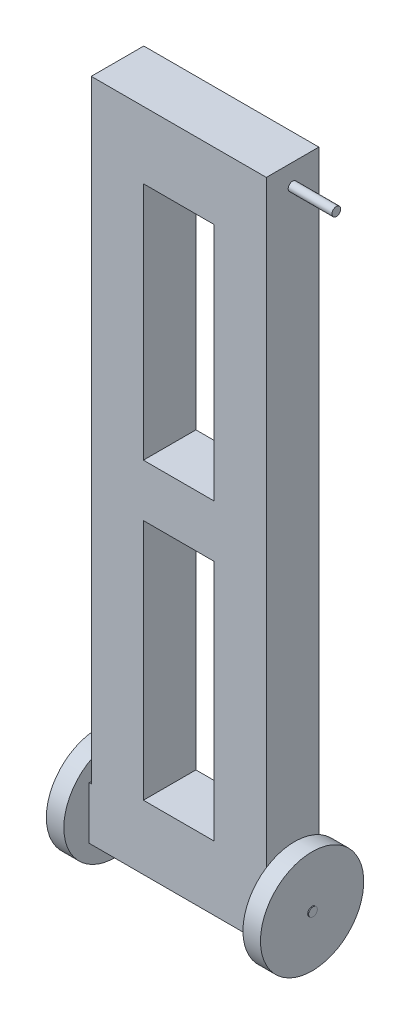
ISO-10303-21;
HEADER;
FILE_DESCRIPTION(('STEP AP214'),'2;1');
FILE_NAME('part.step','',(''),(''),'','','');
FILE_SCHEMA(('AUTOMOTIVE_DESIGN { 1 0 10303 214 1 1 1 1 }'));
ENDSEC;
DATA;
#1=APPLICATION_CONTEXT('core data for automotive mechanical design processes');
#2=APPLICATION_PROTOCOL_DEFINITION('international standard','automotive_design',2000,#1);
#3=PRODUCT_CONTEXT('',#1,'mechanical');
#4=PRODUCT('Part','Part','',(#3));
#5=PRODUCT_RELATED_PRODUCT_CATEGORY('part','',(#4));
#6=PRODUCT_DEFINITION_FORMATION('','',#4);
#7=PRODUCT_DEFINITION_CONTEXT('part definition',#1,'design');
#8=PRODUCT_DEFINITION('design','',#6,#7);
#9=PRODUCT_DEFINITION_SHAPE('','',#8);
#10=(LENGTH_UNIT() NAMED_UNIT(*) SI_UNIT(.MILLI.,.METRE.));
#11=(NAMED_UNIT(*) PLANE_ANGLE_UNIT() SI_UNIT($,.RADIAN.));
#12=(NAMED_UNIT(*) SI_UNIT($,.STERADIAN.) SOLID_ANGLE_UNIT());
#13=UNCERTAINTY_MEASURE_WITH_UNIT(LENGTH_MEASURE(1.E-05),#10,'distance_accuracy_value','');
#14=(GEOMETRIC_REPRESENTATION_CONTEXT(3) GLOBAL_UNCERTAINTY_ASSIGNED_CONTEXT((#13)) GLOBAL_UNIT_ASSIGNED_CONTEXT((#10,
#11,#12)) REPRESENTATION_CONTEXT('',''));
#15=CARTESIAN_POINT('',(0.,0.,0.));
#16=DIRECTION('',(0.,0.,1.));
#17=DIRECTION('',(1.,0.,0.));
#18=AXIS2_PLACEMENT_3D('',#15,#16,#17);
#19=CARTESIAN_POINT('',(61.15,0.,0.));
#20=DIRECTION('',(-1.,0.,0.));
#21=DIRECTION('',(0.,0.,1.));
#22=AXIS2_PLACEMENT_3D('',#19,#20,#21);
#23=CYLINDRICAL_SURFACE('',#22,29.5);
#24=CARTESIAN_POINT('',(-61.15,0.,0.));
#25=DIRECTION('',(1.,0.,0.));
#26=DIRECTION('',(0.,0.,-1.));
#27=AXIS2_PLACEMENT_3D('',#24,#25,#26);
#28=CIRCLE('',#27,29.5);
#29=CARTESIAN_POINT('',(-61.15,0.,29.5));
#30=VERTEX_POINT('',#29);
#31=EDGE_CURVE('E61',#30,#30,#28,.T.);
#32=CARTESIAN_POINT('',(-51.15,0.,0.));
#33=DIRECTION('',(1.,0.,0.));
#34=DIRECTION('',(0.,0.,-1.));
#35=AXIS2_PLACEMENT_3D('',#32,#33,#34);
#36=CIRCLE('',#35,29.5);
#37=CARTESIAN_POINT('',(-51.15,0.,29.5));
#38=VERTEX_POINT('',#37);
#39=EDGE_CURVE('E57',#38,#38,#36,.T.);
#40=CARTESIAN_POINT('',(-61.15,0.,29.5));
#41=CARTESIAN_POINT('',(-61.0458333333333,0.,29.5));
#42=CARTESIAN_POINT('',(-60.9416666666667,0.,29.5));
#43=CARTESIAN_POINT('',(-60.7333333333333,0.,29.5));
#44=CARTESIAN_POINT('',(-60.6291666666667,0.,29.5));
#45=CARTESIAN_POINT('',(-60.4208333333333,0.,29.5));
#46=CARTESIAN_POINT('',(-60.3166666666667,0.,29.5));
#47=CARTESIAN_POINT('',(-60.1083333333333,0.,29.5));
#48=CARTESIAN_POINT('',(-60.0041666666667,0.,29.5));
#49=CARTESIAN_POINT('',(-59.7958333333333,0.,29.5));
#50=CARTESIAN_POINT('',(-59.6916666666667,0.,29.5));
#51=CARTESIAN_POINT('',(-59.4833333333333,0.,29.5));
#52=CARTESIAN_POINT('',(-59.3791666666667,0.,29.5));
#53=CARTESIAN_POINT('',(-59.1708333333333,0.,29.5));
#54=CARTESIAN_POINT('',(-59.0666666666667,0.,29.5));
#55=CARTESIAN_POINT('',(-58.8583333333333,0.,29.5));
#56=CARTESIAN_POINT('',(-58.7541666666667,0.,29.5));
#57=CARTESIAN_POINT('',(-58.5458333333333,0.,29.5));
#58=CARTESIAN_POINT('',(-58.4416666666667,0.,29.5));
#59=CARTESIAN_POINT('',(-58.2333333333333,0.,29.5));
#60=CARTESIAN_POINT('',(-58.1291666666667,0.,29.5));
#61=CARTESIAN_POINT('',(-57.9208333333333,0.,29.5));
#62=CARTESIAN_POINT('',(-57.8166666666667,0.,29.5));
#63=CARTESIAN_POINT('',(-57.6083333333333,0.,29.5));
#64=CARTESIAN_POINT('',(-57.5041666666667,0.,29.5));
#65=CARTESIAN_POINT('',(-57.2958333333333,0.,29.5));
#66=CARTESIAN_POINT('',(-57.1916666666667,0.,29.5));
#67=CARTESIAN_POINT('',(-56.9833333333333,0.,29.5));
#68=CARTESIAN_POINT('',(-56.8791666666667,0.,29.5));
#69=CARTESIAN_POINT('',(-56.6708333333333,0.,29.5));
#70=CARTESIAN_POINT('',(-56.5666666666667,0.,29.5));
#71=CARTESIAN_POINT('',(-56.3583333333333,0.,29.5));
#72=CARTESIAN_POINT('',(-56.2541666666667,0.,29.5));
#73=CARTESIAN_POINT('',(-56.0458333333333,0.,29.5));
#74=CARTESIAN_POINT('',(-55.9416666666667,0.,29.5));
#75=CARTESIAN_POINT('',(-55.7333333333333,0.,29.5));
#76=CARTESIAN_POINT('',(-55.6291666666667,0.,29.5));
#77=CARTESIAN_POINT('',(-55.4208333333333,0.,29.5));
#78=CARTESIAN_POINT('',(-55.3166666666667,0.,29.5));
#79=CARTESIAN_POINT('',(-55.1083333333333,0.,29.5));
#80=CARTESIAN_POINT('',(-55.0041666666667,0.,29.5));
#81=CARTESIAN_POINT('',(-54.7958333333333,0.,29.5));
#82=CARTESIAN_POINT('',(-54.6916666666667,0.,29.5));
#83=CARTESIAN_POINT('',(-54.4833333333333,0.,29.5));
#84=CARTESIAN_POINT('',(-54.3791666666667,0.,29.5));
#85=CARTESIAN_POINT('',(-54.1708333333333,0.,29.5));
#86=CARTESIAN_POINT('',(-54.0666666666667,0.,29.5));
#87=CARTESIAN_POINT('',(-53.8583333333333,0.,29.5));
#88=CARTESIAN_POINT('',(-53.7541666666667,0.,29.5));
#89=CARTESIAN_POINT('',(-53.5458333333333,0.,29.5));
#90=CARTESIAN_POINT('',(-53.4416666666667,0.,29.5));
#91=CARTESIAN_POINT('',(-53.2333333333333,0.,29.5));
#92=CARTESIAN_POINT('',(-53.1291666666667,0.,29.5));
#93=CARTESIAN_POINT('',(-52.9208333333333,0.,29.5));
#94=CARTESIAN_POINT('',(-52.8166666666667,0.,29.5));
#95=CARTESIAN_POINT('',(-52.6083333333333,0.,29.5));
#96=CARTESIAN_POINT('',(-52.5041666666667,0.,29.5));
#97=CARTESIAN_POINT('',(-52.2958333333333,0.,29.5));
#98=CARTESIAN_POINT('',(-52.1916666666667,0.,29.5));
#99=CARTESIAN_POINT('',(-51.9833333333333,0.,29.5));
#100=CARTESIAN_POINT('',(-51.8791666666667,0.,29.5));
#101=CARTESIAN_POINT('',(-51.6708333333333,0.,29.5));
#102=CARTESIAN_POINT('',(-51.5666666666667,0.,29.5));
#103=CARTESIAN_POINT('',(-51.3583333333333,0.,29.5));
#104=CARTESIAN_POINT('',(-51.2541666666667,0.,29.5));
#105=CARTESIAN_POINT('',(-51.15,0.,29.5));
#106=B_SPLINE_CURVE_WITH_KNOTS('',3,(#40,#41,#42,#43,#44,#45,#46,#47,#48,#49,#50,#51,#52,#53,
#54,#55,#56,#57,#58,#59,#60,#61,#62,#63,#64,#65,#66,#67,#68,#69,#70,#71,#72,#73,#74,#75,#76,#77,
#78,#79,#80,#81,#82,#83,#84,#85,#86,#87,#88,#89,#90,#91,#92,#93,#94,#95,#96,#97,#98,#99,#100,
#101,#102,#103,#104,#105),.UNSPECIFIED.,.F.,.F.,(4,2,2,2,2,2,2,2,2,2,2,2,2,2,2,2,2,2,2,2,2,2,2,
2,2,2,2,2,2,2,2,2,4),(0.,0.312499999999993,0.625000000000001,0.937500000000008,1.25,
1.56249999999999,1.875,2.18750000000001,2.5,2.8125,3.125,3.43750000000001,3.75,4.0625,4.375,
4.68750000000001,5.,5.3125,5.62500000000001,5.93750000000001,6.25000000000001,6.5625,
6.87500000000001,7.18750000000001,7.50000000000001,7.8125,8.12500000000001,8.43750000000001,
8.75000000000001,9.0625,9.37500000000001,9.68750000000002,10.),.UNSPECIFIED.);
#107=EDGE_CURVE('BSEAM51',#30,#38,#106,.T.);
#108=ORIENTED_EDGE('',*,*,#31,.T.);
#109=ORIENTED_EDGE('',*,*,#39,.F.);
#110=ORIENTED_EDGE('',*,*,#107,.T.);
#111=ORIENTED_EDGE('',*,*,#107,.F.);
#112=EDGE_LOOP('',(#108,#110,#109,#111));
#113=FACE_BOUND('',#112,.T.);
#114=ADVANCED_FACE('F51',(#113),#23,.T.);
#115=CARTESIAN_POINT('',(-61.15,0.,0.));
#116=DIRECTION('',(1.,0.,0.));
#117=DIRECTION('',(0.,0.,-1.));
#118=AXIS2_PLACEMENT_3D('',#115,#116,#117);
#119=PLANE('',#118);
#120=CARTESIAN_POINT('',(-61.15,0.,0.));
#121=DIRECTION('',(1.,0.,0.));
#122=DIRECTION('',(0.,0.,-1.));
#123=AXIS2_PLACEMENT_3D('',#120,#121,#122);
#124=CIRCLE('',#123,2.5);
#125=CARTESIAN_POINT('',(-61.15,0.,-2.5));
#126=VERTEX_POINT('',#125);
#127=EDGE_CURVE('E11',#126,#126,#124,.F.);
#128=ORIENTED_EDGE('',*,*,#127,.F.);
#129=EDGE_LOOP('',(#128));
#130=FACE_BOUND('',#129,.T.);
#131=ORIENTED_EDGE('',*,*,#31,.F.);
#132=EDGE_LOOP('',(#131));
#133=FACE_BOUND('',#132,.T.);
#134=ADVANCED_FACE('F83',(#130,#133),#119,.F.);
#135=CARTESIAN_POINT('',(-51.15,0.,0.));
#136=DIRECTION('',(1.,0.,0.));
#137=DIRECTION('',(0.,0.,-1.));
#138=AXIS2_PLACEMENT_3D('',#135,#136,#137);
#139=PLANE('',#138);
#140=ORIENTED_EDGE('',*,*,#39,.T.);
#141=EDGE_LOOP('',(#140));
#142=FACE_BOUND('',#141,.T.);
#143=ADVANCED_FACE('F75',(#142),#139,.T.);
#144=CARTESIAN_POINT('',(-61.65,0.,0.));
#145=DIRECTION('',(1.,0.,0.));
#146=DIRECTION('',(0.,0.,-1.));
#147=AXIS2_PLACEMENT_3D('',#144,#145,#146);
#148=CYLINDRICAL_SURFACE('',#147,2.5);
#149=CARTESIAN_POINT('',(-61.65,0.,0.));
#150=DIRECTION('',(-1.,0.,0.));
#151=DIRECTION('',(0.,0.,1.));
#152=AXIS2_PLACEMENT_3D('',#149,#150,#151);
#153=CIRCLE('',#152,2.5);
#154=CARTESIAN_POINT('',(-61.65,0.,2.5));
#155=VERTEX_POINT('',#154);
#156=EDGE_CURVE('E65',#155,#155,#153,.T.);
#157=ORIENTED_EDGE('',*,*,#156,.F.);
#158=EDGE_LOOP('',(#157));
#159=FACE_BOUND('',#158,.T.);
#160=ORIENTED_EDGE('',*,*,#127,.T.);
#161=EDGE_LOOP('',(#160));
#162=FACE_BOUND('',#161,.T.);
#163=ADVANCED_FACE('F73',(#159,#162),#148,.T.);
#164=CARTESIAN_POINT('',(-61.65,0.,0.));
#165=DIRECTION('',(-1.,0.,0.));
#166=DIRECTION('',(0.,0.,1.));
#167=AXIS2_PLACEMENT_3D('',#164,#165,#166);
#168=PLANE('',#167);
#169=ORIENTED_EDGE('',*,*,#156,.T.);
#170=EDGE_LOOP('',(#169));
#171=FACE_BOUND('',#170,.T.);
#172=ADVANCED_FACE('F71',(#171),#168,.T.);
#173=CLOSED_SHELL('',(#114,#134,#143,#163,#172));
#174=MANIFOLD_SOLID_BREP('B2',#173);
#175=CARTESIAN_POINT('',(-20.2139710277099,326.774191842446,-29.501));
#176=DIRECTION('',(-1.,0.,0.));
#177=DIRECTION('',(0.,-1.,0.));
#178=AXIS2_PLACEMENT_3D('',#175,#176,#177);
#179=PLANE('',#178);
#180=DIRECTION('',(0.,1.,0.));
#181=VECTOR('',#180,1.);
#182=CARTESIAN_POINT('',(-20.2139710277099,326.774191842446,-15.));
#183=LINE('',#182,#181);
#184=CARTESIAN_POINT('',(-20.2139710277099,21.7741918424582,-15.));
#185=VERTEX_POINT('',#184);
#186=CARTESIAN_POINT('',(-20.2139710277099,160.136194561291,-15.));
#187=VERTEX_POINT('',#186);
#188=EDGE_CURVE('E283',#185,#187,#183,.T.);
#189=ORIENTED_EDGE('',*,*,#188,.T.);
#190=DIRECTION('',(0.,0.,1.));
#191=VECTOR('',#190,1.);
#192=CARTESIAN_POINT('',(-20.2139710277099,160.136194561291,-29.501));
#193=LINE('',#192,#191);
#194=CARTESIAN_POINT('',(-20.2139710277099,160.136194561291,15.));
#195=VERTEX_POINT('',#194);
#196=EDGE_CURVE('E248',#187,#195,#193,.T.);
#197=ORIENTED_EDGE('',*,*,#196,.T.);
#198=DIRECTION('',(0.,-1.,0.));
#199=VECTOR('',#198,1.);
#200=CARTESIAN_POINT('',(-20.2139710277099,326.774191842446,15.));
#201=LINE('',#200,#199);
#202=CARTESIAN_POINT('',(-20.2139710277099,21.7741918424582,15.));
#203=VERTEX_POINT('',#202);
#204=EDGE_CURVE('E292',#195,#203,#201,.T.);
#205=ORIENTED_EDGE('',*,*,#204,.T.);
#206=DIRECTION('',(0.,0.,1.));
#207=VECTOR('',#206,1.);
#208=CARTESIAN_POINT('',(-20.2139710277099,21.7741918424582,-29.501));
#209=LINE('',#208,#207);
#210=EDGE_CURVE('E300',#185,#203,#209,.T.);
#211=ORIENTED_EDGE('',*,*,#210,.F.);
#212=EDGE_LOOP('',(#189,#197,#205,#211));
#213=FACE_BOUND('',#212,.T.);
#214=ADVANCED_FACE('F122',(#213),#179,.F.);
#215=CARTESIAN_POINT('',(20.2139710277099,326.774191842446,-29.501));
#216=DIRECTION('',(-1.,0.,0.));
#217=DIRECTION('',(0.,-1.,0.));
#218=AXIS2_PLACEMENT_3D('',#215,#216,#217);
#219=PLANE('',#218);
#220=DIRECTION('',(0.,0.,1.));
#221=VECTOR('',#220,1.);
#222=CARTESIAN_POINT('',(20.2139710277099,160.136194561291,-15.));
#223=LINE('',#222,#221);
#224=CARTESIAN_POINT('',(20.2139710277099,160.136194561291,-15.));
#225=VERTEX_POINT('',#224);
#226=CARTESIAN_POINT('',(20.2139710277099,160.136194561291,15.));
#227=VERTEX_POINT('',#226);
#228=EDGE_CURVE('E146',#225,#227,#223,.T.);
#229=ORIENTED_EDGE('',*,*,#228,.F.);
#230=DIRECTION('',(0.,1.,0.));
#231=VECTOR('',#230,1.);
#232=CARTESIAN_POINT('',(20.2139710277099,326.774191842446,-15.));
#233=LINE('',#232,#231);
#234=CARTESIAN_POINT('',(20.2139710277099,21.7741918424582,-15.));
#235=VERTEX_POINT('',#234);
#236=EDGE_CURVE('E247',#235,#225,#233,.T.);
#237=ORIENTED_EDGE('',*,*,#236,.F.);
#238=DIRECTION('',(0.,0.,1.));
#239=VECTOR('',#238,1.);
#240=CARTESIAN_POINT('',(20.2139710277099,21.7741918424582,-29.501));
#241=LINE('',#240,#239);
#242=CARTESIAN_POINT('',(20.2139710277099,21.7741918424582,15.));
#243=VERTEX_POINT('',#242);
#244=EDGE_CURVE('E279',#235,#243,#241,.T.);
#245=ORIENTED_EDGE('',*,*,#244,.T.);
#246=DIRECTION('',(0.,-1.,0.));
#247=VECTOR('',#246,1.);
#248=CARTESIAN_POINT('',(20.2139710277099,326.774191842446,15.));
#249=LINE('',#248,#247);
#250=EDGE_CURVE('E276',#227,#243,#249,.T.);
#251=ORIENTED_EDGE('',*,*,#250,.F.);
#252=EDGE_LOOP('',(#229,#237,#245,#251));
#253=FACE_BOUND('',#252,.T.);
#254=ADVANCED_FACE('F395',(#253),#219,.T.);
#255=CARTESIAN_POINT('',(-61.652,15.,-15.));
#256=DIRECTION('',(0.,0.,1.));
#257=DIRECTION('',(1.,0.,0.));
#258=AXIS2_PLACEMENT_3D('',#255,#256,#257);
#259=PLANE('',#258);
#260=DIRECTION('',(-1.,0.,0.));
#261=VECTOR('',#260,1.);
#262=CARTESIAN_POINT('',(20.2139710277099,160.136194561291,-15.));
#263=LINE('',#262,#261);
#264=EDGE_CURVE('E253',#225,#187,#263,.T.);
#265=ORIENTED_EDGE('',*,*,#264,.T.);
#266=ORIENTED_EDGE('',*,*,#188,.F.);
#267=DIRECTION('',(-1.,0.,0.));
#268=VECTOR('',#267,1.);
#269=CARTESIAN_POINT('',(0.,21.7741918424582,-15.));
#270=LINE('',#269,#268);
#271=EDGE_CURVE('E286',#235,#185,#270,.T.);
#272=ORIENTED_EDGE('',*,*,#271,.F.);
#273=ORIENTED_EDGE('',*,*,#236,.T.);
#274=EDGE_LOOP('',(#265,#266,#272,#273));
#275=FACE_BOUND('',#274,.T.);
#276=DIRECTION('',(1.,0.,0.));
#277=VECTOR('',#276,1.);
#278=CARTESIAN_POINT('',(-61.652,15.,-15.));
#279=LINE('',#278,#277);
#280=CARTESIAN_POINT('',(-51.15,15.,-15.));
#281=VERTEX_POINT('',#280);
#282=CARTESIAN_POINT('',(-50.,15.,-15.));
#283=VERTEX_POINT('',#282);
#284=EDGE_CURVE('E348',#281,#283,#279,.T.);
#285=ORIENTED_EDGE('',*,*,#284,.T.);
#286=DIRECTION('',(0.,-1.,0.));
#287=VECTOR('',#286,1.);
#288=CARTESIAN_POINT('',(-50.,365.,-15.));
#289=LINE('',#288,#287);
#290=CARTESIAN_POINT('',(-50.,365.,-15.));
#291=VERTEX_POINT('',#290);
#292=EDGE_CURVE('E324',#291,#283,#289,.T.);
#293=ORIENTED_EDGE('',*,*,#292,.F.);
#294=DIRECTION('',(-1.,0.,0.));
#295=VECTOR('',#294,1.);
#296=CARTESIAN_POINT('',(-50.,365.,-15.));
#297=LINE('',#296,#295);
#298=CARTESIAN_POINT('',(50.,365.,-15.));
#299=VERTEX_POINT('',#298);
#300=EDGE_CURVE('E322',#299,#291,#297,.T.);
#301=ORIENTED_EDGE('',*,*,#300,.F.);
#302=DIRECTION('',(0.,-1.,0.));
#303=VECTOR('',#302,1.);
#304=CARTESIAN_POINT('',(50.,365.,-15.));
#305=LINE('',#304,#303);
#306=CARTESIAN_POINT('',(50.,15.,-15.));
#307=VERTEX_POINT('',#306);
#308=EDGE_CURVE('E314',#299,#307,#305,.T.);
#309=ORIENTED_EDGE('',*,*,#308,.T.);
#310=CARTESIAN_POINT('',(51.15,15.,-15.));
#311=VERTEX_POINT('',#310);
#312=EDGE_CURVE('E351',#307,#311,#279,.T.);
#313=ORIENTED_EDGE('',*,*,#312,.T.);
#314=DIRECTION('',(0.,-1.,0.));
#315=VECTOR('',#314,1.);
#316=CARTESIAN_POINT('',(51.15,15.,-15.));
#317=LINE('',#316,#315);
#318=CARTESIAN_POINT('',(51.15,-15.,-15.));
#319=VERTEX_POINT('',#318);
#320=EDGE_CURVE('E334',#311,#319,#317,.T.);
#321=ORIENTED_EDGE('',*,*,#320,.T.);
#322=DIRECTION('',(1.,0.,0.));
#323=VECTOR('',#322,1.);
#324=CARTESIAN_POINT('',(-61.652,-15.,-15.));
#325=LINE('',#324,#323);
#326=CARTESIAN_POINT('',(-51.15,-15.,-15.));
#327=VERTEX_POINT('',#326);
#328=EDGE_CURVE('E354',#327,#319,#325,.T.);
#329=ORIENTED_EDGE('',*,*,#328,.F.);
#330=DIRECTION('',(0.,1.,0.));
#331=VECTOR('',#330,1.);
#332=CARTESIAN_POINT('',(-51.15,15.,-15.));
#333=LINE('',#332,#331);
#334=EDGE_CURVE('E358',#327,#281,#333,.T.);
#335=ORIENTED_EDGE('',*,*,#334,.T.);
#336=EDGE_LOOP('',(#285,#293,#301,#309,#313,#321,#329,#335));
#337=FACE_BOUND('',#336,.T.);
#338=CARTESIAN_POINT('',(-20.2139710277099,190.,-15.));
#339=VERTEX_POINT('',#338);
#340=CARTESIAN_POINT('',(-20.2139710277099,326.774191842446,-15.));
#341=VERTEX_POINT('',#340);
#342=EDGE_CURVE('E252',#339,#341,#183,.T.);
#343=ORIENTED_EDGE('',*,*,#342,.F.);
#344=DIRECTION('',(-1.,0.,0.));
#345=VECTOR('',#344,1.);
#346=CARTESIAN_POINT('',(20.2139710277099,190.,-15.));
#347=LINE('',#346,#345);
#348=CARTESIAN_POINT('',(20.2139710277099,190.,-15.));
#349=VERTEX_POINT('',#348);
#350=EDGE_CURVE('E138',#349,#339,#347,.T.);
#351=ORIENTED_EDGE('',*,*,#350,.F.);
#352=CARTESIAN_POINT('',(20.2139710277099,326.774191842446,-15.));
#353=VERTEX_POINT('',#352);
#354=EDGE_CURVE('E237',#349,#353,#233,.T.);
#355=ORIENTED_EDGE('',*,*,#354,.T.);
#356=DIRECTION('',(1.,0.,0.));
#357=VECTOR('',#356,1.);
#358=CARTESIAN_POINT('',(0.,326.774191842446,-15.));
#359=LINE('',#358,#357);
#360=EDGE_CURVE('E303',#341,#353,#359,.T.);
#361=ORIENTED_EDGE('',*,*,#360,.F.);
#362=EDGE_LOOP('',(#343,#351,#355,#361));
#363=FACE_BOUND('',#362,.T.);
#364=ADVANCED_FACE('F251',(#275,#337,#363),#259,.F.);
#365=CARTESIAN_POINT('',(-61.652,15.,15.));
#366=DIRECTION('',(0.,0.,-1.));
#367=DIRECTION('',(-1.,0.,0.));
#368=AXIS2_PLACEMENT_3D('',#365,#366,#367);
#369=PLANE('',#368);
#370=DIRECTION('',(0.,-1.,0.));
#371=VECTOR('',#370,1.);
#372=CARTESIAN_POINT('',(-50.,365.,15.));
#373=LINE('',#372,#371);
#374=CARTESIAN_POINT('',(-50.,365.,15.));
#375=VERTEX_POINT('',#374);
#376=CARTESIAN_POINT('',(-50.,15.,15.));
#377=VERTEX_POINT('',#376);
#378=EDGE_CURVE('E328',#375,#377,#373,.T.);
#379=ORIENTED_EDGE('',*,*,#378,.T.);
#380=DIRECTION('',(1.,0.,0.));
#381=VECTOR('',#380,1.);
#382=CARTESIAN_POINT('',(-61.652,15.,15.));
#383=LINE('',#382,#381);
#384=CARTESIAN_POINT('',(-51.15,15.,15.));
#385=VERTEX_POINT('',#384);
#386=EDGE_CURVE('E343',#385,#377,#383,.T.);
#387=ORIENTED_EDGE('',*,*,#386,.F.);
#388=DIRECTION('',(0.,-1.,0.));
#389=VECTOR('',#388,1.);
#390=CARTESIAN_POINT('',(-51.15,15.,15.));
#391=LINE('',#390,#389);
#392=CARTESIAN_POINT('',(-51.15,-15.,15.));
#393=VERTEX_POINT('',#392);
#394=EDGE_CURVE('E363',#385,#393,#391,.T.);
#395=ORIENTED_EDGE('',*,*,#394,.T.);
#396=DIRECTION('',(1.,0.,0.));
#397=VECTOR('',#396,1.);
#398=CARTESIAN_POINT('',(-61.652,-15.,15.));
#399=LINE('',#398,#397);
#400=CARTESIAN_POINT('',(51.15,-15.,15.));
#401=VERTEX_POINT('',#400);
#402=EDGE_CURVE('E340',#393,#401,#399,.T.);
#403=ORIENTED_EDGE('',*,*,#402,.T.);
#404=DIRECTION('',(0.,1.,0.));
#405=VECTOR('',#404,1.);
#406=CARTESIAN_POINT('',(51.15,15.,15.));
#407=LINE('',#406,#405);
#408=CARTESIAN_POINT('',(51.15,15.,15.));
#409=VERTEX_POINT('',#408);
#410=EDGE_CURVE('E330',#401,#409,#407,.T.);
#411=ORIENTED_EDGE('',*,*,#410,.T.);
#412=CARTESIAN_POINT('',(50.,15.,15.));
#413=VERTEX_POINT('',#412);
#414=EDGE_CURVE('E347',#413,#409,#383,.T.);
#415=ORIENTED_EDGE('',*,*,#414,.F.);
#416=DIRECTION('',(0.,-1.,0.));
#417=VECTOR('',#416,1.);
#418=CARTESIAN_POINT('',(50.,365.,15.));
#419=LINE('',#418,#417);
#420=CARTESIAN_POINT('',(50.,365.,15.));
#421=VERTEX_POINT('',#420);
#422=EDGE_CURVE('E310',#421,#413,#419,.T.);
#423=ORIENTED_EDGE('',*,*,#422,.F.);
#424=DIRECTION('',(1.,0.,0.));
#425=VECTOR('',#424,1.);
#426=CARTESIAN_POINT('',(-50.,365.,15.));
#427=LINE('',#426,#425);
#428=EDGE_CURVE('E320',#375,#421,#427,.T.);
#429=ORIENTED_EDGE('',*,*,#428,.F.);
#430=EDGE_LOOP('',(#379,#387,#395,#403,#411,#415,#423,#429));
#431=FACE_BOUND('',#430,.T.);
#432=DIRECTION('',(-1.,0.,0.));
#433=VECTOR('',#432,1.);
#434=CARTESIAN_POINT('',(20.2139710277099,190.,15.));
#435=LINE('',#434,#433);
#436=CARTESIAN_POINT('',(20.2139710277099,190.,15.));
#437=VERTEX_POINT('',#436);
#438=CARTESIAN_POINT('',(-20.2139710277099,190.,15.));
#439=VERTEX_POINT('',#438);
#440=EDGE_CURVE('E254',#437,#439,#435,.T.);
#441=ORIENTED_EDGE('',*,*,#440,.T.);
#442=CARTESIAN_POINT('',(-20.2139710277099,326.774191842446,15.));
#443=VERTEX_POINT('',#442);
#444=EDGE_CURVE('E293',#443,#439,#201,.T.);
#445=ORIENTED_EDGE('',*,*,#444,.F.);
#446=DIRECTION('',(-1.,0.,0.));
#447=VECTOR('',#446,1.);
#448=CARTESIAN_POINT('',(0.,326.774191842446,15.));
#449=LINE('',#448,#447);
#450=CARTESIAN_POINT('',(20.2139710277099,326.774191842446,15.));
#451=VERTEX_POINT('',#450);
#452=EDGE_CURVE('E289',#451,#443,#449,.T.);
#453=ORIENTED_EDGE('',*,*,#452,.F.);
#454=EDGE_CURVE('E277',#451,#437,#249,.T.);
#455=ORIENTED_EDGE('',*,*,#454,.T.);
#456=EDGE_LOOP('',(#441,#445,#453,#455));
#457=FACE_BOUND('',#456,.T.);
#458=ORIENTED_EDGE('',*,*,#204,.F.);
#459=DIRECTION('',(-1.,0.,0.));
#460=VECTOR('',#459,1.);
#461=CARTESIAN_POINT('',(20.2139710277099,160.136194561291,15.));
#462=LINE('',#461,#460);
#463=EDGE_CURVE('E267',#227,#195,#462,.T.);
#464=ORIENTED_EDGE('',*,*,#463,.F.);
#465=ORIENTED_EDGE('',*,*,#250,.T.);
#466=DIRECTION('',(1.,0.,0.));
#467=VECTOR('',#466,1.);
#468=CARTESIAN_POINT('',(0.,21.7741918424582,15.));
#469=LINE('',#468,#467);
#470=EDGE_CURVE('E296',#203,#243,#469,.T.);
#471=ORIENTED_EDGE('',*,*,#470,.F.);
#472=EDGE_LOOP('',(#458,#464,#465,#471));
#473=FACE_BOUND('',#472,.T.);
#474=ADVANCED_FACE('F421',(#431,#457,#473),#369,.F.);
#475=CARTESIAN_POINT('',(-61.652,15.,-15.));
#476=DIRECTION('',(0.,-1.,0.));
#477=DIRECTION('',(0.,0.,-1.));
#478=AXIS2_PLACEMENT_3D('',#475,#476,#477);
#479=PLANE('',#478);
#480=DIRECTION('',(0.,0.,1.));
#481=VECTOR('',#480,1.);
#482=CARTESIAN_POINT('',(-50.,15.,-15.));
#483=LINE('',#482,#481);
#484=EDGE_CURVE('E316',#283,#377,#483,.T.);
#485=ORIENTED_EDGE('',*,*,#484,.F.);
#486=ORIENTED_EDGE('',*,*,#284,.F.);
#487=DIRECTION('',(0.,0.,1.));
#488=VECTOR('',#487,1.);
#489=CARTESIAN_POINT('',(-51.15,15.,-15.));
#490=LINE('',#489,#488);
#491=EDGE_CURVE('E360',#281,#385,#490,.T.);
#492=ORIENTED_EDGE('',*,*,#491,.T.);
#493=ORIENTED_EDGE('',*,*,#386,.T.);
#494=EDGE_LOOP('',(#485,#486,#492,#493));
#495=FACE_BOUND('',#494,.T.);
#496=ADVANCED_FACE('F423',(#495),#479,.F.);
#497=ORIENTED_EDGE('',*,*,#312,.F.);
#498=DIRECTION('',(0.,0.,1.));
#499=VECTOR('',#498,1.);
#500=CARTESIAN_POINT('',(50.,15.,-15.));
#501=LINE('',#500,#499);
#502=EDGE_CURVE('E306',#307,#413,#501,.T.);
#503=ORIENTED_EDGE('',*,*,#502,.T.);
#504=ORIENTED_EDGE('',*,*,#414,.T.);
#505=DIRECTION('',(0.,0.,-1.));
#506=VECTOR('',#505,1.);
#507=CARTESIAN_POINT('',(51.15,15.,-15.));
#508=LINE('',#507,#506);
#509=EDGE_CURVE('E337',#409,#311,#508,.T.);
#510=ORIENTED_EDGE('',*,*,#509,.T.);
#511=EDGE_LOOP('',(#497,#503,#504,#510));
#512=FACE_BOUND('',#511,.T.);
#513=ADVANCED_FACE('F469',(#512),#479,.F.);
#514=CARTESIAN_POINT('',(51.15,0.,0.));
#515=DIRECTION('',(1.,0.,0.));
#516=DIRECTION('',(0.,0.,-1.));
#517=AXIS2_PLACEMENT_3D('',#514,#515,#516);
#518=PLANE('',#517);
#519=CARTESIAN_POINT('',(51.15,0.,0.));
#520=DIRECTION('',(1.,0.,0.));
#521=DIRECTION('',(0.,0.,-1.));
#522=AXIS2_PLACEMENT_3D('',#519,#520,#521);
#523=CIRCLE('',#522,29.5);
#524=CARTESIAN_POINT('',(51.15,0.,29.5));
#525=VERTEX_POINT('',#524);
#526=EDGE_CURVE('E131',#525,#525,#523,.T.);
#527=ORIENTED_EDGE('',*,*,#526,.F.);
#528=EDGE_LOOP('',(#527));
#529=FACE_BOUND('',#528,.T.);
#530=ORIENTED_EDGE('',*,*,#410,.F.);
#531=DIRECTION('',(0.,0.,1.));
#532=VECTOR('',#531,1.);
#533=CARTESIAN_POINT('',(51.15,-15.,-15.));
#534=LINE('',#533,#532);
#535=EDGE_CURVE('E331',#319,#401,#534,.T.);
#536=ORIENTED_EDGE('',*,*,#535,.F.);
#537=ORIENTED_EDGE('',*,*,#320,.F.);
#538=ORIENTED_EDGE('',*,*,#509,.F.);
#539=EDGE_LOOP('',(#530,#536,#537,#538));
#540=FACE_BOUND('',#539,.T.);
#541=ADVANCED_FACE('F474',(#529,#540),#518,.F.);
#542=CARTESIAN_POINT('',(61.15,0.,0.));
#543=DIRECTION('',(1.,0.,0.));
#544=DIRECTION('',(0.,0.,-1.));
#545=AXIS2_PLACEMENT_3D('',#542,#543,#544);
#546=PLANE('',#545);
#547=CARTESIAN_POINT('',(61.15,0.,0.));
#548=DIRECTION('',(1.,0.,0.));
#549=DIRECTION('',(0.,0.,-1.));
#550=AXIS2_PLACEMENT_3D('',#547,#548,#549);
#551=CIRCLE('',#550,2.5);
#552=CARTESIAN_POINT('',(61.15,0.,-2.5));
#553=VERTEX_POINT('',#552);
#554=EDGE_CURVE('E126',#553,#553,#551,.F.);
#555=ORIENTED_EDGE('',*,*,#554,.T.);
#556=EDGE_LOOP('',(#555));
#557=FACE_BOUND('',#556,.T.);
#558=CARTESIAN_POINT('',(61.15,0.,0.));
#559=DIRECTION('',(1.,0.,0.));
#560=DIRECTION('',(0.,0.,-1.));
#561=AXIS2_PLACEMENT_3D('',#558,#559,#560);
#562=CIRCLE('',#561,29.5);
#563=CARTESIAN_POINT('',(61.15,0.,29.5));
#564=VERTEX_POINT('',#563);
#565=EDGE_CURVE('E49',#564,#564,#562,.T.);
#566=ORIENTED_EDGE('',*,*,#565,.T.);
#567=EDGE_LOOP('',(#566));
#568=FACE_BOUND('',#567,.T.);
#569=ADVANCED_FACE('F374',(#557,#568),#546,.T.);
#570=CARTESIAN_POINT('',(61.15,0.,0.));
#571=DIRECTION('',(-1.,0.,0.));
#572=DIRECTION('',(0.,0.,1.));
#573=AXIS2_PLACEMENT_3D('',#570,#571,#572);
#574=CYLINDRICAL_SURFACE('',#573,29.5);
#575=CARTESIAN_POINT('',(51.15,0.,29.5));
#576=CARTESIAN_POINT('',(51.2541666666667,0.,29.5));
#577=CARTESIAN_POINT('',(51.3583333333333,0.,29.5));
#578=CARTESIAN_POINT('',(51.5666666666667,0.,29.5));
#579=CARTESIAN_POINT('',(51.6708333333333,0.,29.5));
#580=CARTESIAN_POINT('',(51.8791666666667,0.,29.5));
#581=CARTESIAN_POINT('',(51.9833333333333,0.,29.5));
#582=CARTESIAN_POINT('',(52.1916666666667,0.,29.5));
#583=CARTESIAN_POINT('',(52.2958333333333,0.,29.5));
#584=CARTESIAN_POINT('',(52.5041666666667,0.,29.5));
#585=CARTESIAN_POINT('',(52.6083333333333,0.,29.5));
#586=CARTESIAN_POINT('',(52.8166666666667,0.,29.5));
#587=CARTESIAN_POINT('',(52.9208333333333,0.,29.5));
#588=CARTESIAN_POINT('',(53.1291666666667,0.,29.5));
#589=CARTESIAN_POINT('',(53.2333333333333,0.,29.5));
#590=CARTESIAN_POINT('',(53.4416666666667,0.,29.5));
#591=CARTESIAN_POINT('',(53.5458333333333,0.,29.5));
#592=CARTESIAN_POINT('',(53.7541666666667,0.,29.5));
#593=CARTESIAN_POINT('',(53.8583333333333,0.,29.5));
#594=CARTESIAN_POINT('',(54.0666666666667,0.,29.5));
#595=CARTESIAN_POINT('',(54.1708333333333,0.,29.5));
#596=CARTESIAN_POINT('',(54.3791666666667,0.,29.5));
#597=CARTESIAN_POINT('',(54.4833333333333,0.,29.5));
#598=CARTESIAN_POINT('',(54.6916666666667,0.,29.5));
#599=CARTESIAN_POINT('',(54.7958333333333,0.,29.5));
#600=CARTESIAN_POINT('',(55.0041666666667,0.,29.5));
#601=CARTESIAN_POINT('',(55.1083333333333,0.,29.5));
#602=CARTESIAN_POINT('',(55.3166666666667,0.,29.5));
#603=CARTESIAN_POINT('',(55.4208333333333,0.,29.5));
#604=CARTESIAN_POINT('',(55.6291666666667,0.,29.5));
#605=CARTESIAN_POINT('',(55.7333333333333,0.,29.5));
#606=CARTESIAN_POINT('',(55.9416666666667,0.,29.5));
#607=CARTESIAN_POINT('',(56.0458333333333,0.,29.5));
#608=CARTESIAN_POINT('',(56.2541666666667,0.,29.5));
#609=CARTESIAN_POINT('',(56.3583333333333,0.,29.5));
#610=CARTESIAN_POINT('',(56.5666666666667,0.,29.5));
#611=CARTESIAN_POINT('',(56.6708333333333,0.,29.5));
#612=CARTESIAN_POINT('',(56.8791666666667,0.,29.5));
#613=CARTESIAN_POINT('',(56.9833333333333,0.,29.5));
#614=CARTESIAN_POINT('',(57.1916666666667,0.,29.5));
#615=CARTESIAN_POINT('',(57.2958333333333,0.,29.5));
#616=CARTESIAN_POINT('',(57.5041666666667,0.,29.5));
#617=CARTESIAN_POINT('',(57.6083333333333,0.,29.5));
#618=CARTESIAN_POINT('',(57.8166666666667,0.,29.5));
#619=CARTESIAN_POINT('',(57.9208333333333,0.,29.5));
#620=CARTESIAN_POINT('',(58.1291666666667,0.,29.5));
#621=CARTESIAN_POINT('',(58.2333333333333,0.,29.5));
#622=CARTESIAN_POINT('',(58.4416666666667,0.,29.5));
#623=CARTESIAN_POINT('',(58.5458333333333,0.,29.5));
#624=CARTESIAN_POINT('',(58.7541666666667,0.,29.5));
#625=CARTESIAN_POINT('',(58.8583333333333,0.,29.5));
#626=CARTESIAN_POINT('',(59.0666666666667,0.,29.5));
#627=CARTESIAN_POINT('',(59.1708333333333,0.,29.5));
#628=CARTESIAN_POINT('',(59.3791666666667,0.,29.5));
#629=CARTESIAN_POINT('',(59.4833333333333,0.,29.5));
#630=CARTESIAN_POINT('',(59.6916666666667,0.,29.5));
#631=CARTESIAN_POINT('',(59.7958333333333,0.,29.5));
#632=CARTESIAN_POINT('',(60.0041666666667,0.,29.5));
#633=CARTESIAN_POINT('',(60.1083333333333,0.,29.5));
#634=CARTESIAN_POINT('',(60.3166666666667,0.,29.5));
#635=CARTESIAN_POINT('',(60.4208333333333,0.,29.5));
#636=CARTESIAN_POINT('',(60.6291666666667,0.,29.5));
#637=CARTESIAN_POINT('',(60.7333333333333,0.,29.5));
#638=CARTESIAN_POINT('',(60.9416666666667,0.,29.5));
#639=CARTESIAN_POINT('',(61.0458333333333,0.,29.5));
#640=CARTESIAN_POINT('',(61.15,0.,29.5));
#641=B_SPLINE_CURVE_WITH_KNOTS('',3,(#575,#576,#577,#578,#579,#580,#581,#582,#583,#584,#585,
#586,#587,#588,#589,#590,#591,#592,#593,#594,#595,#596,#597,#598,#599,#600,#601,#602,#603,#604,
#605,#606,#607,#608,#609,#610,#611,#612,#613,#614,#615,#616,#617,#618,#619,#620,#621,#622,#623,
#624,#625,#626,#627,#628,#629,#630,#631,#632,#633,#634,#635,#636,#637,#638,#639,#640),
.UNSPECIFIED.,.F.,.F.,(4,2,2,2,2,2,2,2,2,2,2,2,2,2,2,2,2,2,2,2,2,2,2,2,2,2,2,2,2,2,2,2,4),(0.,
0.3125,0.625000000000001,0.937500000000001,1.25,1.5625,1.875,2.1875,2.5,2.8125,3.125,3.4375,
3.75,4.0625,4.375,4.6875,5.,5.3125,5.625,5.9375,6.25,6.5625,6.875,7.1875,7.5,7.8125,8.125,
8.4375,8.75,9.0625,9.375,9.6875,10.),.UNSPECIFIED.);
#642=EDGE_CURVE('BSEAM124',#525,#564,#641,.T.);
#643=ORIENTED_EDGE('',*,*,#526,.T.);
#644=ORIENTED_EDGE('',*,*,#565,.F.);
#645=ORIENTED_EDGE('',*,*,#642,.T.);
#646=ORIENTED_EDGE('',*,*,#642,.F.);
#647=EDGE_LOOP('',(#643,#645,#644,#646));
#648=FACE_BOUND('',#647,.T.);
#649=ADVANCED_FACE('F124',(#648),#574,.T.);
#650=CARTESIAN_POINT('',(61.65,0.,0.));
#651=DIRECTION('',(-1.,0.,0.));
#652=DIRECTION('',(0.,0.,1.));
#653=AXIS2_PLACEMENT_3D('',#650,#651,#652);
#654=CYLINDRICAL_SURFACE('',#653,2.5);
#655=ORIENTED_EDGE('',*,*,#554,.F.);
#656=EDGE_LOOP('',(#655));
#657=FACE_BOUND('',#656,.T.);
#658=CARTESIAN_POINT('',(61.65,0.,0.));
#659=DIRECTION('',(1.,0.,0.));
#660=DIRECTION('',(0.,0.,-1.));
#661=AXIS2_PLACEMENT_3D('',#658,#659,#660);
#662=CIRCLE('',#661,2.5);
#663=CARTESIAN_POINT('',(61.65,0.,-2.5));
#664=VERTEX_POINT('',#663);
#665=EDGE_CURVE('E365',#664,#664,#662,.T.);
#666=ORIENTED_EDGE('',*,*,#665,.F.);
#667=EDGE_LOOP('',(#666));
#668=FACE_BOUND('',#667,.T.);
#669=ADVANCED_FACE('F377',(#657,#668),#654,.T.);
#670=CARTESIAN_POINT('',(61.65,0.,0.));
#671=DIRECTION('',(1.,0.,0.));
#672=DIRECTION('',(0.,0.,-1.));
#673=AXIS2_PLACEMENT_3D('',#670,#671,#672);
#674=PLANE('',#673);
#675=ORIENTED_EDGE('',*,*,#665,.T.);
#676=EDGE_LOOP('',(#675));
#677=FACE_BOUND('',#676,.T.);
#678=ADVANCED_FACE('F380',(#677),#674,.T.);
#679=CARTESIAN_POINT('',(-51.15,0.,0.));
#680=DIRECTION('',(1.,0.,0.));
#681=DIRECTION('',(0.,0.,-1.));
#682=AXIS2_PLACEMENT_3D('',#679,#680,#681);
#683=PLANE('',#682);
#684=ORIENTED_EDGE('',*,*,#491,.F.);
#685=ORIENTED_EDGE('',*,*,#334,.F.);
#686=DIRECTION('',(0.,0.,-1.));
#687=VECTOR('',#686,1.);
#688=CARTESIAN_POINT('',(-51.15,-15.,-15.));
#689=LINE('',#688,#687);
#690=EDGE_CURVE('E346',#393,#327,#689,.T.);
#691=ORIENTED_EDGE('',*,*,#690,.F.);
#692=ORIENTED_EDGE('',*,*,#394,.F.);
#693=EDGE_LOOP('',(#684,#685,#691,#692));
#694=FACE_BOUND('',#693,.T.);
#695=ADVANCED_FACE('F385',(#694),#683,.F.);
#696=CARTESIAN_POINT('',(-61.652,-15.,-15.));
#697=DIRECTION('',(0.,1.,0.));
#698=DIRECTION('',(0.,0.,1.));
#699=AXIS2_PLACEMENT_3D('',#696,#697,#698);
#700=PLANE('',#699);
#701=ORIENTED_EDGE('',*,*,#402,.F.);
#702=ORIENTED_EDGE('',*,*,#690,.T.);
#703=ORIENTED_EDGE('',*,*,#328,.T.);
#704=ORIENTED_EDGE('',*,*,#535,.T.);
#705=EDGE_LOOP('',(#701,#702,#703,#704));
#706=FACE_BOUND('',#705,.T.);
#707=ADVANCED_FACE('F391',(#706),#700,.F.);
#708=CARTESIAN_POINT('',(-50.,365.,-15.));
#709=DIRECTION('',(1.,0.,0.));
#710=DIRECTION('',(0.,0.,-1.));
#711=AXIS2_PLACEMENT_3D('',#708,#709,#710);
#712=PLANE('',#711);
#713=ORIENTED_EDGE('',*,*,#292,.T.);
#714=ORIENTED_EDGE('',*,*,#484,.T.);
#715=ORIENTED_EDGE('',*,*,#378,.F.);
#716=DIRECTION('',(0.,0.,1.));
#717=VECTOR('',#716,1.);
#718=CARTESIAN_POINT('',(-50.,365.,-15.));
#719=LINE('',#718,#717);
#720=EDGE_CURVE('E317',#291,#375,#719,.T.);
#721=ORIENTED_EDGE('',*,*,#720,.F.);
#722=EDGE_LOOP('',(#713,#714,#715,#721));
#723=FACE_BOUND('',#722,.T.);
#724=ADVANCED_FACE('F487',(#723),#712,.F.);
#725=CARTESIAN_POINT('',(0.,365.,0.));
#726=DIRECTION('',(0.,1.,0.));
#727=DIRECTION('',(0.,0.,1.));
#728=AXIS2_PLACEMENT_3D('',#725,#726,#727);
#729=PLANE('',#728);
#730=ORIENTED_EDGE('',*,*,#720,.T.);
#731=ORIENTED_EDGE('',*,*,#428,.T.);
#732=DIRECTION('',(0.,0.,1.));
#733=VECTOR('',#732,1.);
#734=CARTESIAN_POINT('',(50.,365.,-15.));
#735=LINE('',#734,#733);
#736=EDGE_CURVE('E307',#299,#421,#735,.T.);
#737=ORIENTED_EDGE('',*,*,#736,.F.);
#738=ORIENTED_EDGE('',*,*,#300,.T.);
#739=EDGE_LOOP('',(#730,#731,#737,#738));
#740=FACE_BOUND('',#739,.T.);
#741=ADVANCED_FACE('F460',(#740),#729,.T.);
#742=CARTESIAN_POINT('',(50.,365.,-15.));
#743=DIRECTION('',(1.,0.,0.));
#744=DIRECTION('',(0.,0.,-1.));
#745=AXIS2_PLACEMENT_3D('',#742,#743,#744);
#746=PLANE('',#745);
#747=CARTESIAN_POINT('',(50.,353.134108108508,0.));
#748=DIRECTION('',(1.,0.,0.));
#749=DIRECTION('',(0.,0.,-1.));
#750=AXIS2_PLACEMENT_3D('',#747,#748,#749);
#751=CIRCLE('',#750,2.5);
#752=CARTESIAN_POINT('',(50.,353.134108108508,-2.5));
#753=VERTEX_POINT('',#752);
#754=EDGE_CURVE('E263',#753,#753,#751,.T.);
#755=ORIENTED_EDGE('',*,*,#754,.F.);
#756=EDGE_LOOP('',(#755));
#757=FACE_BOUND('',#756,.T.);
#758=ORIENTED_EDGE('',*,*,#502,.F.);
#759=ORIENTED_EDGE('',*,*,#308,.F.);
#760=ORIENTED_EDGE('',*,*,#736,.T.);
#761=ORIENTED_EDGE('',*,*,#422,.T.);
#762=EDGE_LOOP('',(#758,#759,#760,#761));
#763=FACE_BOUND('',#762,.T.);
#764=ADVANCED_FACE('F416',(#757,#763),#746,.T.);
#765=CARTESIAN_POINT('',(0.,21.7741918424582,-29.501));
#766=DIRECTION('',(0.,-1.,0.));
#767=DIRECTION('',(0.,0.,-1.));
#768=AXIS2_PLACEMENT_3D('',#765,#766,#767);
#769=PLANE('',#768);
#770=ORIENTED_EDGE('',*,*,#271,.T.);
#771=ORIENTED_EDGE('',*,*,#210,.T.);
#772=ORIENTED_EDGE('',*,*,#470,.T.);
#773=ORIENTED_EDGE('',*,*,#244,.F.);
#774=EDGE_LOOP('',(#770,#771,#772,#773));
#775=FACE_BOUND('',#774,.T.);
#776=ADVANCED_FACE('F408',(#775),#769,.F.);
#777=ORIENTED_EDGE('',*,*,#444,.T.);
#778=DIRECTION('',(0.,0.,-1.));
#779=VECTOR('',#778,1.);
#780=CARTESIAN_POINT('',(-20.2139710277099,190.,-29.501));
#781=LINE('',#780,#779);
#782=EDGE_CURVE('E269',#439,#339,#781,.T.);
#783=ORIENTED_EDGE('',*,*,#782,.T.);
#784=ORIENTED_EDGE('',*,*,#342,.T.);
#785=DIRECTION('',(0.,0.,1.));
#786=VECTOR('',#785,1.);
#787=CARTESIAN_POINT('',(-20.2139710277099,326.774191842446,-29.501));
#788=LINE('',#787,#786);
#789=EDGE_CURVE('E299',#341,#443,#788,.T.);
#790=ORIENTED_EDGE('',*,*,#789,.T.);
#791=EDGE_LOOP('',(#777,#783,#784,#790));
#792=FACE_BOUND('',#791,.T.);
#793=ADVANCED_FACE('F398',(#792),#179,.F.);
#794=CARTESIAN_POINT('',(0.,326.774191842446,-29.501));
#795=DIRECTION('',(0.,1.,0.));
#796=DIRECTION('',(0.,0.,1.));
#797=AXIS2_PLACEMENT_3D('',#794,#795,#796);
#798=PLANE('',#797);
#799=ORIENTED_EDGE('',*,*,#360,.T.);
#800=DIRECTION('',(0.,0.,1.));
#801=VECTOR('',#800,1.);
#802=CARTESIAN_POINT('',(20.2139710277099,326.774191842446,-29.501));
#803=LINE('',#802,#801);
#804=EDGE_CURVE('E243',#353,#451,#803,.T.);
#805=ORIENTED_EDGE('',*,*,#804,.T.);
#806=ORIENTED_EDGE('',*,*,#452,.T.);
#807=ORIENTED_EDGE('',*,*,#789,.F.);
#808=EDGE_LOOP('',(#799,#805,#806,#807));
#809=FACE_BOUND('',#808,.T.);
#810=ADVANCED_FACE('F407',(#809),#798,.F.);
#811=DIRECTION('',(0.,0.,-1.));
#812=VECTOR('',#811,1.);
#813=CARTESIAN_POINT('',(20.2139710277099,190.,-15.));
#814=LINE('',#813,#812);
#815=EDGE_CURVE('E240',#437,#349,#814,.T.);
#816=ORIENTED_EDGE('',*,*,#815,.F.);
#817=ORIENTED_EDGE('',*,*,#454,.F.);
#818=ORIENTED_EDGE('',*,*,#804,.F.);
#819=ORIENTED_EDGE('',*,*,#354,.F.);
#820=EDGE_LOOP('',(#816,#817,#818,#819));
#821=FACE_BOUND('',#820,.T.);
#822=ADVANCED_FACE('F238',(#821),#219,.T.);
#823=CARTESIAN_POINT('',(20.2139710277099,160.136194561291,-15.));
#824=DIRECTION('',(0.,-1.,0.));
#825=DIRECTION('',(1.,0.,0.));
#826=AXIS2_PLACEMENT_3D('',#823,#824,#825);
#827=PLANE('',#826);
#828=ORIENTED_EDGE('',*,*,#196,.F.);
#829=ORIENTED_EDGE('',*,*,#264,.F.);
#830=ORIENTED_EDGE('',*,*,#228,.T.);
#831=ORIENTED_EDGE('',*,*,#463,.T.);
#832=EDGE_LOOP('',(#828,#829,#830,#831));
#833=FACE_BOUND('',#832,.T.);
#834=ADVANCED_FACE('F435',(#833),#827,.T.);
#835=CARTESIAN_POINT('',(20.2139710277099,190.,-15.));
#836=DIRECTION('',(0.,1.,0.));
#837=DIRECTION('',(-1.,0.,0.));
#838=AXIS2_PLACEMENT_3D('',#835,#836,#837);
#839=PLANE('',#838);
#840=ORIENTED_EDGE('',*,*,#782,.F.);
#841=ORIENTED_EDGE('',*,*,#440,.F.);
#842=ORIENTED_EDGE('',*,*,#815,.T.);
#843=ORIENTED_EDGE('',*,*,#350,.T.);
#844=EDGE_LOOP('',(#840,#841,#842,#843));
#845=FACE_BOUND('',#844,.T.);
#846=ADVANCED_FACE('F257',(#845),#839,.T.);
#847=CARTESIAN_POINT('',(82.0710678118659,353.134108108508,0.));
#848=DIRECTION('',(-1.,0.,0.));
#849=DIRECTION('',(0.,0.,1.));
#850=AXIS2_PLACEMENT_3D('',#847,#848,#849);
#851=CYLINDRICAL_SURFACE('',#850,2.5);
#852=CARTESIAN_POINT('',(75.0000000000004,353.134108108508,0.));
#853=DIRECTION('',(-1.,0.,0.));
#854=DIRECTION('',(0.,0.,1.));
#855=AXIS2_PLACEMENT_3D('',#852,#853,#854);
#856=CIRCLE('',#855,2.5);
#857=CARTESIAN_POINT('',(75.0000000000004,353.134108108508,2.50000000000001));
#858=VERTEX_POINT('',#857);
#859=EDGE_CURVE('E259',#858,#858,#856,.T.);
#860=ORIENTED_EDGE('',*,*,#859,.T.);
#861=EDGE_LOOP('',(#860));
#862=FACE_BOUND('',#861,.T.);
#863=ORIENTED_EDGE('',*,*,#754,.T.);
#864=EDGE_LOOP('',(#863));
#865=FACE_BOUND('',#864,.T.);
#866=ADVANCED_FACE('F441',(#862,#865),#851,.T.);
#867=CARTESIAN_POINT('',(75.0000000000004,429.426544261894,328.617376748682));
#868=DIRECTION('',(-1.,0.,0.));
#869=DIRECTION('',(0.,-0.985786809618403,0.168001089229715));
#870=AXIS2_PLACEMENT_3D('',#867,#868,#869);
#871=PLANE('',#870);
#872=ORIENTED_EDGE('',*,*,#859,.F.);
#873=EDGE_LOOP('',(#872));
#874=FACE_BOUND('',#873,.T.);
#875=ADVANCED_FACE('F446',(#874),#871,.F.);
#876=CLOSED_SHELL('',(#214,#254,#364,#474,#496,#513,#541,#569,#649,#669,#678,#695,#707,#724,
#741,#764,#776,#793,#810,#822,#834,#846,#866,#875));
#877=MANIFOLD_SOLID_BREP('B6',#876);
#878=ADVANCED_BREP_SHAPE_REPRESENTATION('',(#18,#174,#877),#14);
#879=SHAPE_DEFINITION_REPRESENTATION(#9,#878);
ENDSEC;
END-ISO-10303-21;
